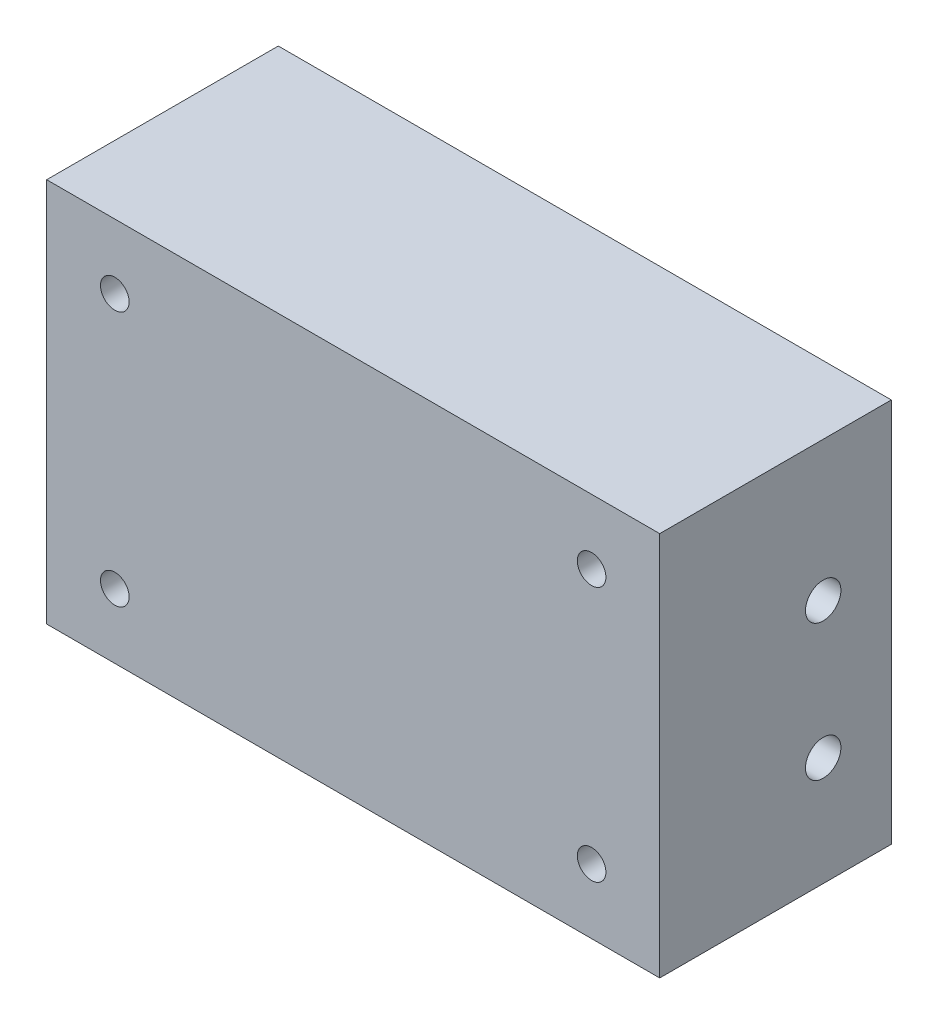
ISO-10303-21;
HEADER;
FILE_DESCRIPTION(('STEP AP214'),'2;1');
FILE_NAME('part.step','',(''),(''),'','','');
FILE_SCHEMA(('AUTOMOTIVE_DESIGN { 1 0 10303 214 1 1 1 1 }'));
ENDSEC;
DATA;
#1=APPLICATION_CONTEXT('core data for automotive mechanical design processes');
#2=APPLICATION_PROTOCOL_DEFINITION('international standard','automotive_design',2000,#1);
#3=PRODUCT_CONTEXT('',#1,'mechanical');
#4=PRODUCT('Part','Part','',(#3));
#5=PRODUCT_RELATED_PRODUCT_CATEGORY('part','',(#4));
#6=PRODUCT_DEFINITION_FORMATION('','',#4);
#7=PRODUCT_DEFINITION_CONTEXT('part definition',#1,'design');
#8=PRODUCT_DEFINITION('design','',#6,#7);
#9=PRODUCT_DEFINITION_SHAPE('','',#8);
#10=(LENGTH_UNIT() NAMED_UNIT(*) SI_UNIT(.MILLI.,.METRE.));
#11=(NAMED_UNIT(*) PLANE_ANGLE_UNIT() SI_UNIT($,.RADIAN.));
#12=(NAMED_UNIT(*) SI_UNIT($,.STERADIAN.) SOLID_ANGLE_UNIT());
#13=UNCERTAINTY_MEASURE_WITH_UNIT(LENGTH_MEASURE(1.E-05),#10,'distance_accuracy_value','');
#14=(GEOMETRIC_REPRESENTATION_CONTEXT(3) GLOBAL_UNCERTAINTY_ASSIGNED_CONTEXT((#13)) GLOBAL_UNIT_ASSIGNED_CONTEXT((#10,
#11,#12)) REPRESENTATION_CONTEXT('',''));
#15=CARTESIAN_POINT('',(0.,0.,0.));
#16=DIRECTION('',(0.,0.,1.));
#17=DIRECTION('',(1.,0.,0.));
#18=AXIS2_PLACEMENT_3D('',#15,#16,#17);
#19=CARTESIAN_POINT('',(0.,0.,0.));
#20=DIRECTION('',(0.,0.,1.));
#21=DIRECTION('',(1.,0.,0.));
#22=AXIS2_PLACEMENT_3D('',#19,#20,#21);
#23=PLANE('',#22);
#24=CARTESIAN_POINT('',(44.45,23.8125,0.));
#25=DIRECTION('',(0.,0.,1.));
#26=DIRECTION('',(1.,0.,0.));
#27=AXIS2_PLACEMENT_3D('',#24,#25,#26);
#28=CIRCLE('',#27,2.667);
#29=CARTESIAN_POINT('',(47.117,23.8125,0.));
#30=VERTEX_POINT('',#29);
#31=EDGE_CURVE('E193',#30,#30,#28,.F.);
#32=ORIENTED_EDGE('',*,*,#31,.F.);
#33=EDGE_LOOP('',(#32));
#34=FACE_BOUND('',#33,.T.);
#35=CARTESIAN_POINT('',(-44.45,23.8125,0.));
#36=DIRECTION('',(0.,0.,1.));
#37=DIRECTION('',(1.,0.,0.));
#38=AXIS2_PLACEMENT_3D('',#35,#36,#37);
#39=CIRCLE('',#38,2.667);
#40=CARTESIAN_POINT('',(-41.783,23.8125,0.));
#41=VERTEX_POINT('',#40);
#42=EDGE_CURVE('E211',#41,#41,#39,.T.);
#43=ORIENTED_EDGE('',*,*,#42,.T.);
#44=EDGE_LOOP('',(#43));
#45=FACE_BOUND('',#44,.T.);
#46=CARTESIAN_POINT('',(-44.45,-23.8125,0.));
#47=DIRECTION('',(0.,0.,1.));
#48=DIRECTION('',(1.,0.,0.));
#49=AXIS2_PLACEMENT_3D('',#46,#47,#48);
#50=CIRCLE('',#49,2.667);
#51=CARTESIAN_POINT('',(-41.783,-23.8125,0.));
#52=VERTEX_POINT('',#51);
#53=EDGE_CURVE('E208',#52,#52,#50,.T.);
#54=ORIENTED_EDGE('',*,*,#53,.T.);
#55=EDGE_LOOP('',(#54));
#56=FACE_BOUND('',#55,.T.);
#57=CARTESIAN_POINT('',(44.45,-23.8125,0.));
#58=DIRECTION('',(0.,0.,1.));
#59=DIRECTION('',(1.,0.,0.));
#60=AXIS2_PLACEMENT_3D('',#57,#58,#59);
#61=CIRCLE('',#60,2.667);
#62=CARTESIAN_POINT('',(47.117,-23.8125,0.));
#63=VERTEX_POINT('',#62);
#64=EDGE_CURVE('E205',#63,#63,#61,.F.);
#65=ORIENTED_EDGE('',*,*,#64,.F.);
#66=EDGE_LOOP('',(#65));
#67=FACE_BOUND('',#66,.T.);
#68=DIRECTION('',(1.,0.,0.));
#69=VECTOR('',#68,1.);
#70=CARTESIAN_POINT('',(0.,30.7975,0.));
#71=LINE('',#70,#69);
#72=CARTESIAN_POINT('',(-52.07,30.7975,0.));
#73=VERTEX_POINT('',#72);
#74=CARTESIAN_POINT('',(52.07,30.7975,0.));
#75=VERTEX_POINT('',#74);
#76=EDGE_CURVE('E191',#73,#75,#71,.T.);
#77=ORIENTED_EDGE('',*,*,#76,.T.);
#78=DIRECTION('',(0.,-1.,0.));
#79=VECTOR('',#78,1.);
#80=CARTESIAN_POINT('',(52.07,0.,0.));
#81=LINE('',#80,#79);
#82=CARTESIAN_POINT('',(52.07,-30.7975,0.));
#83=VERTEX_POINT('',#82);
#84=EDGE_CURVE('E170',#75,#83,#81,.T.);
#85=ORIENTED_EDGE('',*,*,#84,.T.);
#86=DIRECTION('',(1.,0.,0.));
#87=VECTOR('',#86,1.);
#88=CARTESIAN_POINT('',(0.,-30.7975,0.));
#89=LINE('',#88,#87);
#90=CARTESIAN_POINT('',(-52.07,-30.7975,0.));
#91=VERTEX_POINT('',#90);
#92=EDGE_CURVE('E203',#91,#83,#89,.T.);
#93=ORIENTED_EDGE('',*,*,#92,.F.);
#94=DIRECTION('',(0.,-1.,0.));
#95=VECTOR('',#94,1.);
#96=CARTESIAN_POINT('',(-52.07,0.,0.));
#97=LINE('',#96,#95);
#98=EDGE_CURVE('E55',#73,#91,#97,.T.);
#99=ORIENTED_EDGE('',*,*,#98,.F.);
#100=EDGE_LOOP('',(#77,#85,#93,#99));
#101=FACE_BOUND('',#100,.T.);
#102=ADVANCED_FACE('F38',(#34,#45,#56,#67,#101),#23,.F.);
#103=CARTESIAN_POINT('',(-57.15,0.,5.08));
#104=DIRECTION('',(-1.,0.,0.));
#105=DIRECTION('',(0.,0.,1.));
#106=AXIS2_PLACEMENT_3D('',#103,#104,#105);
#107=PLANE('',#106);
#108=CARTESIAN_POINT('',(-57.15,-15.5575,-25.4));
#109=DIRECTION('',(1.,0.,0.));
#110=DIRECTION('',(0.,0.,-1.));
#111=AXIS2_PLACEMENT_3D('',#108,#109,#110);
#112=CIRCLE('',#111,3.302);
#113=CARTESIAN_POINT('',(-57.15,-15.5575,-28.702));
#114=VERTEX_POINT('',#113);
#115=EDGE_CURVE('E152',#114,#114,#112,.T.);
#116=ORIENTED_EDGE('',*,*,#115,.T.);
#117=EDGE_LOOP('',(#116));
#118=FACE_BOUND('',#117,.T.);
#119=CARTESIAN_POINT('',(-57.15,9.8425,-25.4));
#120=DIRECTION('',(1.,0.,0.));
#121=DIRECTION('',(0.,0.,-1.));
#122=AXIS2_PLACEMENT_3D('',#119,#120,#121);
#123=CIRCLE('',#122,3.302);
#124=CARTESIAN_POINT('',(-57.15,9.8425,-28.702));
#125=VERTEX_POINT('',#124);
#126=EDGE_CURVE('E159',#125,#125,#123,.T.);
#127=ORIENTED_EDGE('',*,*,#126,.T.);
#128=EDGE_LOOP('',(#127));
#129=FACE_BOUND('',#128,.T.);
#130=DIRECTION('',(0.,1.,0.));
#131=VECTOR('',#130,1.);
#132=CARTESIAN_POINT('',(-57.15,0.,5.08));
#133=LINE('',#132,#131);
#134=CARTESIAN_POINT('',(-57.15,-35.8775,5.08000000000001));
#135=VERTEX_POINT('',#134);
#136=CARTESIAN_POINT('',(-57.15,35.8775,5.08000000000001));
#137=VERTEX_POINT('',#136);
#138=EDGE_CURVE('E118',#135,#137,#133,.T.);
#139=ORIENTED_EDGE('',*,*,#138,.T.);
#140=DIRECTION('',(0.,0.,1.));
#141=VECTOR('',#140,1.);
#142=CARTESIAN_POINT('',(-57.15,35.8775,5.08000000000001));
#143=LINE('',#142,#141);
#144=CARTESIAN_POINT('',(-57.15,35.8775,-38.1));
#145=VERTEX_POINT('',#144);
#146=EDGE_CURVE('E144',#145,#137,#143,.T.);
#147=ORIENTED_EDGE('',*,*,#146,.F.);
#148=DIRECTION('',(0.,1.,0.));
#149=VECTOR('',#148,1.);
#150=CARTESIAN_POINT('',(-57.15,0.,-38.1));
#151=LINE('',#150,#149);
#152=CARTESIAN_POINT('',(-57.15,-35.8775,-38.1));
#153=VERTEX_POINT('',#152);
#154=EDGE_CURVE('E184',#153,#145,#151,.T.);
#155=ORIENTED_EDGE('',*,*,#154,.F.);
#156=DIRECTION('',(0.,0.,1.));
#157=VECTOR('',#156,1.);
#158=CARTESIAN_POINT('',(-57.15,-35.8775,5.08));
#159=LINE('',#158,#157);
#160=EDGE_CURVE('E137',#153,#135,#159,.T.);
#161=ORIENTED_EDGE('',*,*,#160,.T.);
#162=EDGE_LOOP('',(#139,#147,#155,#161));
#163=FACE_BOUND('',#162,.T.);
#164=ADVANCED_FACE('F40',(#118,#129,#163),#107,.T.);
#165=CARTESIAN_POINT('',(-44.45,23.8125,5.08));
#166=DIRECTION('',(0.,0.,-1.));
#167=DIRECTION('',(-1.,0.,0.));
#168=AXIS2_PLACEMENT_3D('',#165,#166,#167);
#169=CYLINDRICAL_SURFACE('',#168,2.667);
#170=CARTESIAN_POINT('',(-44.45,23.8125,5.08));
#171=DIRECTION('',(0.,0.,1.));
#172=DIRECTION('',(1.,0.,0.));
#173=AXIS2_PLACEMENT_3D('',#170,#171,#172);
#174=CIRCLE('',#173,2.667);
#175=CARTESIAN_POINT('',(-41.783,23.8125,5.08));
#176=VERTEX_POINT('',#175);
#177=EDGE_CURVE('E47',#176,#176,#174,.T.);
#178=ORIENTED_EDGE('',*,*,#177,.T.);
#179=EDGE_LOOP('',(#178));
#180=FACE_BOUND('',#179,.T.);
#181=ORIENTED_EDGE('',*,*,#42,.F.);
#182=EDGE_LOOP('',(#181));
#183=FACE_BOUND('',#182,.T.);
#184=ADVANCED_FACE('F256',(#180,#183),#169,.F.);
#185=CARTESIAN_POINT('',(-44.45,-23.8125,5.08));
#186=DIRECTION('',(0.,0.,-1.));
#187=DIRECTION('',(-1.,0.,0.));
#188=AXIS2_PLACEMENT_3D('',#185,#186,#187);
#189=CYLINDRICAL_SURFACE('',#188,2.667);
#190=CARTESIAN_POINT('',(-44.45,-23.8125,5.08));
#191=DIRECTION('',(0.,0.,1.));
#192=DIRECTION('',(1.,0.,0.));
#193=AXIS2_PLACEMENT_3D('',#190,#191,#192);
#194=CIRCLE('',#193,2.667);
#195=CARTESIAN_POINT('',(-41.783,-23.8125,5.08));
#196=VERTEX_POINT('',#195);
#197=EDGE_CURVE('E197',#196,#196,#194,.T.);
#198=ORIENTED_EDGE('',*,*,#197,.T.);
#199=EDGE_LOOP('',(#198));
#200=FACE_BOUND('',#199,.T.);
#201=ORIENTED_EDGE('',*,*,#53,.F.);
#202=EDGE_LOOP('',(#201));
#203=FACE_BOUND('',#202,.T.);
#204=ADVANCED_FACE('F266',(#200,#203),#189,.F.);
#205=CARTESIAN_POINT('',(44.45,-23.8125,5.08));
#206=DIRECTION('',(0.,0.,-1.));
#207=DIRECTION('',(-1.,0.,0.));
#208=AXIS2_PLACEMENT_3D('',#205,#206,#207);
#209=CYLINDRICAL_SURFACE('',#208,2.667);
#210=CARTESIAN_POINT('',(44.45,-23.8125,5.08));
#211=DIRECTION('',(0.,0.,1.));
#212=DIRECTION('',(1.,0.,0.));
#213=AXIS2_PLACEMENT_3D('',#210,#211,#212);
#214=CIRCLE('',#213,2.667);
#215=CARTESIAN_POINT('',(47.117,-23.8125,5.08));
#216=VERTEX_POINT('',#215);
#217=EDGE_CURVE('E117',#216,#216,#214,.F.);
#218=ORIENTED_EDGE('',*,*,#217,.F.);
#219=EDGE_LOOP('',(#218));
#220=FACE_BOUND('',#219,.T.);
#221=ORIENTED_EDGE('',*,*,#64,.T.);
#222=EDGE_LOOP('',(#221));
#223=FACE_BOUND('',#222,.T.);
#224=ADVANCED_FACE('F270',(#220,#223),#209,.F.);
#225=CARTESIAN_POINT('',(57.15,0.,5.08));
#226=DIRECTION('',(-1.,0.,0.));
#227=DIRECTION('',(0.,0.,1.));
#228=AXIS2_PLACEMENT_3D('',#225,#226,#227);
#229=PLANE('',#228);
#230=CARTESIAN_POINT('',(57.15,-15.5575,-25.4));
#231=DIRECTION('',(1.,0.,0.));
#232=DIRECTION('',(0.,0.,-1.));
#233=AXIS2_PLACEMENT_3D('',#230,#231,#232);
#234=CIRCLE('',#233,3.302);
#235=CARTESIAN_POINT('',(57.15,-15.5575,-28.702));
#236=VERTEX_POINT('',#235);
#237=EDGE_CURVE('E156',#236,#236,#234,.T.);
#238=ORIENTED_EDGE('',*,*,#237,.F.);
#239=EDGE_LOOP('',(#238));
#240=FACE_BOUND('',#239,.T.);
#241=CARTESIAN_POINT('',(57.15,9.8425,-25.4));
#242=DIRECTION('',(1.,0.,0.));
#243=DIRECTION('',(0.,0.,-1.));
#244=AXIS2_PLACEMENT_3D('',#241,#242,#243);
#245=CIRCLE('',#244,3.302);
#246=CARTESIAN_POINT('',(57.15,9.8425,-28.702));
#247=VERTEX_POINT('',#246);
#248=EDGE_CURVE('E149',#247,#247,#245,.T.);
#249=ORIENTED_EDGE('',*,*,#248,.F.);
#250=EDGE_LOOP('',(#249));
#251=FACE_BOUND('',#250,.T.);
#252=DIRECTION('',(0.,1.,0.));
#253=VECTOR('',#252,1.);
#254=CARTESIAN_POINT('',(57.15,0.,5.08));
#255=LINE('',#254,#253);
#256=CARTESIAN_POINT('',(57.15,-35.8775,5.07999999999999));
#257=VERTEX_POINT('',#256);
#258=CARTESIAN_POINT('',(57.15,35.8775,5.08));
#259=VERTEX_POINT('',#258);
#260=EDGE_CURVE('E107',#257,#259,#255,.T.);
#261=ORIENTED_EDGE('',*,*,#260,.F.);
#262=DIRECTION('',(0.,0.,-1.));
#263=VECTOR('',#262,1.);
#264=CARTESIAN_POINT('',(57.15,-35.8775,5.08));
#265=LINE('',#264,#263);
#266=CARTESIAN_POINT('',(57.15,-35.8775,-38.1));
#267=VERTEX_POINT('',#266);
#268=EDGE_CURVE('E110',#257,#267,#265,.T.);
#269=ORIENTED_EDGE('',*,*,#268,.T.);
#270=DIRECTION('',(0.,1.,0.));
#271=VECTOR('',#270,1.);
#272=CARTESIAN_POINT('',(57.15,0.,-38.1));
#273=LINE('',#272,#271);
#274=CARTESIAN_POINT('',(57.15,35.8775,-38.1));
#275=VERTEX_POINT('',#274);
#276=EDGE_CURVE('E174',#267,#275,#273,.T.);
#277=ORIENTED_EDGE('',*,*,#276,.T.);
#278=DIRECTION('',(0.,0.,-1.));
#279=VECTOR('',#278,1.);
#280=CARTESIAN_POINT('',(57.15,35.8775,5.08));
#281=LINE('',#280,#279);
#282=EDGE_CURVE('E112',#259,#275,#281,.T.);
#283=ORIENTED_EDGE('',*,*,#282,.F.);
#284=EDGE_LOOP('',(#261,#269,#277,#283));
#285=FACE_BOUND('',#284,.T.);
#286=ADVANCED_FACE('F109',(#240,#251,#285),#229,.F.);
#287=CARTESIAN_POINT('',(44.45,23.8125,5.08));
#288=DIRECTION('',(0.,0.,-1.));
#289=DIRECTION('',(-1.,0.,0.));
#290=AXIS2_PLACEMENT_3D('',#287,#288,#289);
#291=CYLINDRICAL_SURFACE('',#290,2.667);
#292=CARTESIAN_POINT('',(44.45,23.8125,5.08));
#293=DIRECTION('',(0.,0.,1.));
#294=DIRECTION('',(1.,0.,0.));
#295=AXIS2_PLACEMENT_3D('',#292,#293,#294);
#296=CIRCLE('',#295,2.667);
#297=CARTESIAN_POINT('',(47.117,23.8125,5.08));
#298=VERTEX_POINT('',#297);
#299=EDGE_CURVE('E11',#298,#298,#296,.F.);
#300=ORIENTED_EDGE('',*,*,#299,.F.);
#301=EDGE_LOOP('',(#300));
#302=FACE_BOUND('',#301,.T.);
#303=ORIENTED_EDGE('',*,*,#31,.T.);
#304=EDGE_LOOP('',(#303));
#305=FACE_BOUND('',#304,.T.);
#306=ADVANCED_FACE('F247',(#302,#305),#291,.F.);
#307=CARTESIAN_POINT('',(0.,0.,5.08));
#308=DIRECTION('',(0.,0.,1.));
#309=DIRECTION('',(1.,0.,0.));
#310=AXIS2_PLACEMENT_3D('',#307,#308,#309);
#311=PLANE('',#310);
#312=ORIENTED_EDGE('',*,*,#260,.T.);
#313=DIRECTION('',(1.,0.,0.));
#314=VECTOR('',#313,1.);
#315=CARTESIAN_POINT('',(57.15,35.8775,5.08));
#316=LINE('',#315,#314);
#317=EDGE_CURVE('E147',#137,#259,#316,.T.);
#318=ORIENTED_EDGE('',*,*,#317,.F.);
#319=ORIENTED_EDGE('',*,*,#138,.F.);
#320=DIRECTION('',(1.,0.,0.));
#321=VECTOR('',#320,1.);
#322=CARTESIAN_POINT('',(0.,-35.8775,5.08));
#323=LINE('',#322,#321);
#324=EDGE_CURVE('E125',#135,#257,#323,.T.);
#325=ORIENTED_EDGE('',*,*,#324,.T.);
#326=EDGE_LOOP('',(#312,#318,#319,#325));
#327=FACE_BOUND('',#326,.T.);
#328=ORIENTED_EDGE('',*,*,#217,.T.);
#329=EDGE_LOOP('',(#328));
#330=FACE_BOUND('',#329,.T.);
#331=ORIENTED_EDGE('',*,*,#197,.F.);
#332=EDGE_LOOP('',(#331));
#333=FACE_BOUND('',#332,.T.);
#334=ORIENTED_EDGE('',*,*,#177,.F.);
#335=EDGE_LOOP('',(#334));
#336=FACE_BOUND('',#335,.T.);
#337=ORIENTED_EDGE('',*,*,#299,.T.);
#338=EDGE_LOOP('',(#337));
#339=FACE_BOUND('',#338,.T.);
#340=ADVANCED_FACE('F130',(#327,#330,#333,#336,#339),#311,.T.);
#341=CARTESIAN_POINT('',(-52.07,0.,-38.1));
#342=DIRECTION('',(-1.,0.,0.));
#343=DIRECTION('',(0.,-1.,0.));
#344=AXIS2_PLACEMENT_3D('',#341,#342,#343);
#345=PLANE('',#344);
#346=CARTESIAN_POINT('',(-52.07,-15.5575,-25.4));
#347=DIRECTION('',(-1.,0.,0.));
#348=DIRECTION('',(0.,-1.,0.));
#349=AXIS2_PLACEMENT_3D('',#346,#347,#348);
#350=CIRCLE('',#349,3.302);
#351=CARTESIAN_POINT('',(-52.07,-18.8595,-25.4));
#352=VERTEX_POINT('',#351);
#353=EDGE_CURVE('E167',#352,#352,#350,.T.);
#354=ORIENTED_EDGE('',*,*,#353,.T.);
#355=EDGE_LOOP('',(#354));
#356=FACE_BOUND('',#355,.T.);
#357=CARTESIAN_POINT('',(-52.07,9.8425,-25.4));
#358=DIRECTION('',(-1.,0.,0.));
#359=DIRECTION('',(0.,-1.,0.));
#360=AXIS2_PLACEMENT_3D('',#357,#358,#359);
#361=CIRCLE('',#360,3.302);
#362=CARTESIAN_POINT('',(-52.07,6.5405,-25.4));
#363=VERTEX_POINT('',#362);
#364=EDGE_CURVE('E164',#363,#363,#361,.T.);
#365=ORIENTED_EDGE('',*,*,#364,.T.);
#366=EDGE_LOOP('',(#365));
#367=FACE_BOUND('',#366,.T.);
#368=ORIENTED_EDGE('',*,*,#98,.T.);
#369=DIRECTION('',(0.,0.,1.));
#370=VECTOR('',#369,1.);
#371=CARTESIAN_POINT('',(-52.07,-30.7975,-38.1));
#372=LINE('',#371,#370);
#373=CARTESIAN_POINT('',(-52.07,-30.7975,-38.1));
#374=VERTEX_POINT('',#373);
#375=EDGE_CURVE('E187',#374,#91,#372,.T.);
#376=ORIENTED_EDGE('',*,*,#375,.F.);
#377=DIRECTION('',(0.,-1.,0.));
#378=VECTOR('',#377,1.);
#379=CARTESIAN_POINT('',(-52.07,0.,-38.1));
#380=LINE('',#379,#378);
#381=CARTESIAN_POINT('',(-52.07,30.7975,-38.1));
#382=VERTEX_POINT('',#381);
#383=EDGE_CURVE('E62',#382,#374,#380,.T.);
#384=ORIENTED_EDGE('',*,*,#383,.F.);
#385=DIRECTION('',(0.,0.,1.));
#386=VECTOR('',#385,1.);
#387=CARTESIAN_POINT('',(-52.07,30.7975,-38.1));
#388=LINE('',#387,#386);
#389=EDGE_CURVE('E189',#382,#73,#388,.T.);
#390=ORIENTED_EDGE('',*,*,#389,.T.);
#391=EDGE_LOOP('',(#368,#376,#384,#390));
#392=FACE_BOUND('',#391,.T.);
#393=ADVANCED_FACE('F238',(#356,#367,#392),#345,.F.);
#394=CARTESIAN_POINT('',(0.,0.,-38.1));
#395=DIRECTION('',(0.,0.,1.));
#396=DIRECTION('',(1.,0.,0.));
#397=AXIS2_PLACEMENT_3D('',#394,#395,#396);
#398=PLANE('',#397);
#399=ORIENTED_EDGE('',*,*,#383,.T.);
#400=DIRECTION('',(-1.,0.,0.));
#401=VECTOR('',#400,1.);
#402=CARTESIAN_POINT('',(0.,-30.7975,-38.1));
#403=LINE('',#402,#401);
#404=CARTESIAN_POINT('',(52.07,-30.7975,-38.1));
#405=VERTEX_POINT('',#404);
#406=EDGE_CURVE('E132',#405,#374,#403,.T.);
#407=ORIENTED_EDGE('',*,*,#406,.F.);
#408=DIRECTION('',(0.,-1.,0.));
#409=VECTOR('',#408,1.);
#410=CARTESIAN_POINT('',(52.07,0.,-38.1));
#411=LINE('',#410,#409);
#412=CARTESIAN_POINT('',(52.07,30.7975,-38.1));
#413=VERTEX_POINT('',#412);
#414=EDGE_CURVE('E171',#413,#405,#411,.T.);
#415=ORIENTED_EDGE('',*,*,#414,.F.);
#416=DIRECTION('',(-1.,0.,0.));
#417=VECTOR('',#416,1.);
#418=CARTESIAN_POINT('',(57.15,30.7975,-38.1));
#419=LINE('',#418,#417);
#420=EDGE_CURVE('E138',#413,#382,#419,.T.);
#421=ORIENTED_EDGE('',*,*,#420,.T.);
#422=EDGE_LOOP('',(#399,#407,#415,#421));
#423=FACE_BOUND('',#422,.T.);
#424=ORIENTED_EDGE('',*,*,#154,.T.);
#425=DIRECTION('',(-1.,0.,0.));
#426=VECTOR('',#425,1.);
#427=CARTESIAN_POINT('',(57.15,35.8775,-38.1));
#428=LINE('',#427,#426);
#429=EDGE_CURVE('E141',#275,#145,#428,.T.);
#430=ORIENTED_EDGE('',*,*,#429,.F.);
#431=ORIENTED_EDGE('',*,*,#276,.F.);
#432=DIRECTION('',(-1.,0.,0.));
#433=VECTOR('',#432,1.);
#434=CARTESIAN_POINT('',(0.,-35.8775,-38.1));
#435=LINE('',#434,#433);
#436=EDGE_CURVE('E128',#267,#153,#435,.T.);
#437=ORIENTED_EDGE('',*,*,#436,.T.);
#438=EDGE_LOOP('',(#424,#430,#431,#437));
#439=FACE_BOUND('',#438,.T.);
#440=ADVANCED_FACE('F224',(#423,#439),#398,.F.);
#441=CARTESIAN_POINT('',(52.07,0.,-38.1));
#442=DIRECTION('',(-1.,0.,0.));
#443=DIRECTION('',(0.,-1.,0.));
#444=AXIS2_PLACEMENT_3D('',#441,#442,#443);
#445=PLANE('',#444);
#446=CARTESIAN_POINT('',(52.07,-15.5575,-25.4));
#447=DIRECTION('',(-1.,0.,0.));
#448=DIRECTION('',(0.,-1.,0.));
#449=AXIS2_PLACEMENT_3D('',#446,#447,#448);
#450=CIRCLE('',#449,3.302);
#451=CARTESIAN_POINT('',(52.07,-18.8595,-25.4));
#452=VERTEX_POINT('',#451);
#453=EDGE_CURVE('E42',#452,#452,#450,.T.);
#454=ORIENTED_EDGE('',*,*,#453,.F.);
#455=EDGE_LOOP('',(#454));
#456=FACE_BOUND('',#455,.T.);
#457=CARTESIAN_POINT('',(52.07,9.8425,-25.4));
#458=DIRECTION('',(-1.,0.,0.));
#459=DIRECTION('',(0.,-1.,0.));
#460=AXIS2_PLACEMENT_3D('',#457,#458,#459);
#461=CIRCLE('',#460,3.302);
#462=CARTESIAN_POINT('',(52.07,6.5405,-25.4));
#463=VERTEX_POINT('',#462);
#464=EDGE_CURVE('E155',#463,#463,#461,.T.);
#465=ORIENTED_EDGE('',*,*,#464,.F.);
#466=EDGE_LOOP('',(#465));
#467=FACE_BOUND('',#466,.T.);
#468=ORIENTED_EDGE('',*,*,#84,.F.);
#469=DIRECTION('',(0.,0.,1.));
#470=VECTOR('',#469,1.);
#471=CARTESIAN_POINT('',(52.07,30.7975,-38.1));
#472=LINE('',#471,#470);
#473=EDGE_CURVE('E176',#413,#75,#472,.T.);
#474=ORIENTED_EDGE('',*,*,#473,.F.);
#475=ORIENTED_EDGE('',*,*,#414,.T.);
#476=DIRECTION('',(0.,0.,1.));
#477=VECTOR('',#476,1.);
#478=CARTESIAN_POINT('',(52.07,-30.7975,-38.1));
#479=LINE('',#478,#477);
#480=EDGE_CURVE('E179',#405,#83,#479,.T.);
#481=ORIENTED_EDGE('',*,*,#480,.T.);
#482=EDGE_LOOP('',(#468,#474,#475,#481));
#483=FACE_BOUND('',#482,.T.);
#484=ADVANCED_FACE('F221',(#456,#467,#483),#445,.T.);
#485=CARTESIAN_POINT('',(-57.15,9.8425,-25.4));
#486=DIRECTION('',(1.,0.,0.));
#487=DIRECTION('',(0.,0.,-1.));
#488=AXIS2_PLACEMENT_3D('',#485,#486,#487);
#489=CYLINDRICAL_SURFACE('',#488,3.302);
#490=ORIENTED_EDGE('',*,*,#464,.T.);
#491=EDGE_LOOP('',(#490));
#492=FACE_BOUND('',#491,.T.);
#493=ORIENTED_EDGE('',*,*,#248,.T.);
#494=EDGE_LOOP('',(#493));
#495=FACE_BOUND('',#494,.T.);
#496=ADVANCED_FACE('F218',(#492,#495),#489,.F.);
#497=CARTESIAN_POINT('',(-57.15,-15.5575,-25.4));
#498=DIRECTION('',(1.,0.,0.));
#499=DIRECTION('',(0.,0.,-1.));
#500=AXIS2_PLACEMENT_3D('',#497,#498,#499);
#501=CYLINDRICAL_SURFACE('',#500,3.302);
#502=ORIENTED_EDGE('',*,*,#453,.T.);
#503=EDGE_LOOP('',(#502));
#504=FACE_BOUND('',#503,.T.);
#505=ORIENTED_EDGE('',*,*,#237,.T.);
#506=EDGE_LOOP('',(#505));
#507=FACE_BOUND('',#506,.T.);
#508=ADVANCED_FACE('F282',(#504,#507),#501,.F.);
#509=ORIENTED_EDGE('',*,*,#126,.F.);
#510=EDGE_LOOP('',(#509));
#511=FACE_BOUND('',#510,.T.);
#512=ORIENTED_EDGE('',*,*,#364,.F.);
#513=EDGE_LOOP('',(#512));
#514=FACE_BOUND('',#513,.T.);
#515=ADVANCED_FACE('F284',(#511,#514),#489,.F.);
#516=ORIENTED_EDGE('',*,*,#115,.F.);
#517=EDGE_LOOP('',(#516));
#518=FACE_BOUND('',#517,.T.);
#519=ORIENTED_EDGE('',*,*,#353,.F.);
#520=EDGE_LOOP('',(#519));
#521=FACE_BOUND('',#520,.T.);
#522=ADVANCED_FACE('F290',(#518,#521),#501,.F.);
#523=CARTESIAN_POINT('',(0.,35.8775,0.));
#524=DIRECTION('',(0.,1.,0.));
#525=DIRECTION('',(0.,0.,1.));
#526=AXIS2_PLACEMENT_3D('',#523,#524,#525);
#527=PLANE('',#526);
#528=ORIENTED_EDGE('',*,*,#282,.T.);
#529=ORIENTED_EDGE('',*,*,#429,.T.);
#530=ORIENTED_EDGE('',*,*,#146,.T.);
#531=ORIENTED_EDGE('',*,*,#317,.T.);
#532=EDGE_LOOP('',(#528,#529,#530,#531));
#533=FACE_BOUND('',#532,.T.);
#534=ADVANCED_FACE('F296',(#533),#527,.T.);
#535=CARTESIAN_POINT('',(0.,30.7975,0.));
#536=DIRECTION('',(0.,1.,0.));
#537=DIRECTION('',(0.,0.,1.));
#538=AXIS2_PLACEMENT_3D('',#535,#536,#537);
#539=PLANE('',#538);
#540=ORIENTED_EDGE('',*,*,#389,.F.);
#541=ORIENTED_EDGE('',*,*,#420,.F.);
#542=ORIENTED_EDGE('',*,*,#473,.T.);
#543=ORIENTED_EDGE('',*,*,#76,.F.);
#544=EDGE_LOOP('',(#540,#541,#542,#543));
#545=FACE_BOUND('',#544,.T.);
#546=ADVANCED_FACE('F232',(#545),#539,.F.);
#547=CARTESIAN_POINT('',(0.,-35.8775,0.));
#548=DIRECTION('',(0.,1.,0.));
#549=DIRECTION('',(0.,0.,1.));
#550=AXIS2_PLACEMENT_3D('',#547,#548,#549);
#551=PLANE('',#550);
#552=ORIENTED_EDGE('',*,*,#324,.F.);
#553=ORIENTED_EDGE('',*,*,#160,.F.);
#554=ORIENTED_EDGE('',*,*,#436,.F.);
#555=ORIENTED_EDGE('',*,*,#268,.F.);
#556=EDGE_LOOP('',(#552,#553,#554,#555));
#557=FACE_BOUND('',#556,.T.);
#558=ADVANCED_FACE('F123',(#557),#551,.F.);
#559=CARTESIAN_POINT('',(0.,-30.7975,0.));
#560=DIRECTION('',(0.,1.,0.));
#561=DIRECTION('',(0.,0.,1.));
#562=AXIS2_PLACEMENT_3D('',#559,#560,#561);
#563=PLANE('',#562);
#564=ORIENTED_EDGE('',*,*,#406,.T.);
#565=ORIENTED_EDGE('',*,*,#375,.T.);
#566=ORIENTED_EDGE('',*,*,#92,.T.);
#567=ORIENTED_EDGE('',*,*,#480,.F.);
#568=EDGE_LOOP('',(#564,#565,#566,#567));
#569=FACE_BOUND('',#568,.T.);
#570=ADVANCED_FACE('F237',(#569),#563,.T.);
#571=CLOSED_SHELL('',(#102,#164,#184,#204,#224,#286,#306,#340,#393,#440,#484,#496,#508,#515,
#522,#534,#546,#558,#570));
#572=MANIFOLD_SOLID_BREP('B2',#571);
#573=ADVANCED_BREP_SHAPE_REPRESENTATION('',(#18,#572),#14);
#574=SHAPE_DEFINITION_REPRESENTATION(#9,#573);
ENDSEC;
END-ISO-10303-21;
